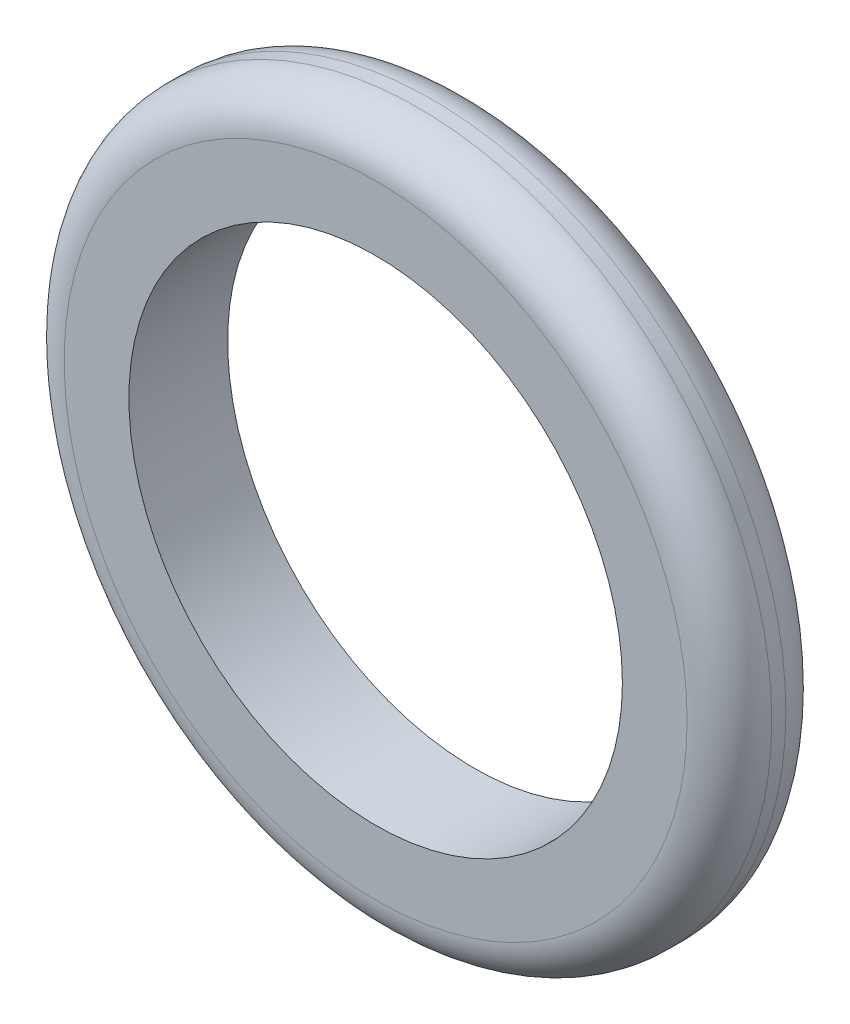
ISO-10303-21;
HEADER;
FILE_DESCRIPTION(('STEP AP214'),'2;1');
FILE_NAME('part.step','',(''),(''),'','','');
FILE_SCHEMA(('AUTOMOTIVE_DESIGN { 1 0 10303 214 1 1 1 1 }'));
ENDSEC;
DATA;
#1=APPLICATION_CONTEXT('core data for automotive mechanical design processes');
#2=APPLICATION_PROTOCOL_DEFINITION('international standard','automotive_design',2000,#1);
#3=PRODUCT_CONTEXT('',#1,'mechanical');
#4=PRODUCT('Part','Part','',(#3));
#5=PRODUCT_RELATED_PRODUCT_CATEGORY('part','',(#4));
#6=PRODUCT_DEFINITION_FORMATION('','',#4);
#7=PRODUCT_DEFINITION_CONTEXT('part definition',#1,'design');
#8=PRODUCT_DEFINITION('design','',#6,#7);
#9=PRODUCT_DEFINITION_SHAPE('','',#8);
#10=(LENGTH_UNIT() NAMED_UNIT(*) SI_UNIT(.MILLI.,.METRE.));
#11=(NAMED_UNIT(*) PLANE_ANGLE_UNIT() SI_UNIT($,.RADIAN.));
#12=(NAMED_UNIT(*) SI_UNIT($,.STERADIAN.) SOLID_ANGLE_UNIT());
#13=UNCERTAINTY_MEASURE_WITH_UNIT(LENGTH_MEASURE(1.E-05),#10,'distance_accuracy_value','');
#14=(GEOMETRIC_REPRESENTATION_CONTEXT(3) GLOBAL_UNCERTAINTY_ASSIGNED_CONTEXT((#13)) GLOBAL_UNIT_ASSIGNED_CONTEXT((#10,
#11,#12)) REPRESENTATION_CONTEXT('',''));
#15=CARTESIAN_POINT('',(0.,0.,0.));
#16=DIRECTION('',(0.,0.,1.));
#17=DIRECTION('',(1.,0.,0.));
#18=AXIS2_PLACEMENT_3D('',#15,#16,#17);
#19=CARTESIAN_POINT('',(0.,-38.2965768946703,35.));
#20=DIRECTION('',(0.,0.,-1.));
#21=DIRECTION('',(-1.,0.,0.));
#22=AXIS2_PLACEMENT_3D('',#19,#20,#21);
#23=CYLINDRICAL_SURFACE('',#22,250.932647595222);
#24=CARTESIAN_POINT('',(0.,-38.2965768946703,-5.));
#25=DIRECTION('',(0.,0.,1.));
#26=DIRECTION('',(1.,0.,0.));
#27=AXIS2_PLACEMENT_3D('',#24,#25,#26);
#28=CIRCLE('',#27,250.932647595222);
#29=CARTESIAN_POINT('',(250.932647595222,-38.2965768946703,-5.));
#30=VERTEX_POINT('',#29);
#31=EDGE_CURVE('E42',#30,#30,#28,.T.);
#32=ORIENTED_EDGE('',*,*,#31,.T.);
#33=EDGE_LOOP('',(#32));
#34=FACE_BOUND('',#33,.T.);
#35=CARTESIAN_POINT('',(0.,-38.2965768946703,5.));
#36=DIRECTION('',(0.,0.,1.));
#37=DIRECTION('',(1.,0.,0.));
#38=AXIS2_PLACEMENT_3D('',#35,#36,#37);
#39=CIRCLE('',#38,250.932647595222);
#40=CARTESIAN_POINT('',(250.932647595222,-38.2965768946703,5.));
#41=VERTEX_POINT('',#40);
#42=EDGE_CURVE('E46',#41,#41,#39,.F.);
#43=ORIENTED_EDGE('',*,*,#42,.T.);
#44=EDGE_LOOP('',(#43));
#45=FACE_BOUND('',#44,.T.);
#46=ADVANCED_FACE('F31',(#34,#45),#23,.T.);
#47=CARTESIAN_POINT('',(0.,-38.2965768946703,35.));
#48=DIRECTION('',(0.,0.,1.));
#49=DIRECTION('',(1.,0.,0.));
#50=AXIS2_PLACEMENT_3D('',#47,#48,#49);
#51=PLANE('',#50);
#52=CARTESIAN_POINT('',(0.,-38.2965768946703,35.));
#53=DIRECTION('',(0.,0.,1.));
#54=DIRECTION('',(1.,0.,0.));
#55=AXIS2_PLACEMENT_3D('',#52,#53,#54);
#56=CIRCLE('',#55,175.);
#57=CARTESIAN_POINT('',(175.,-38.2965768946703,35.));
#58=VERTEX_POINT('',#57);
#59=EDGE_CURVE('E52',#58,#58,#56,.T.);
#60=ORIENTED_EDGE('',*,*,#59,.F.);
#61=EDGE_LOOP('',(#60));
#62=FACE_BOUND('',#61,.T.);
#63=CARTESIAN_POINT('',(0.,-38.2965768946703,35.));
#64=DIRECTION('',(0.,0.,1.));
#65=DIRECTION('',(1.,0.,0.));
#66=AXIS2_PLACEMENT_3D('',#63,#64,#65);
#67=CIRCLE('',#66,220.932647595222);
#68=CARTESIAN_POINT('',(220.932647595222,-38.2965768946703,35.));
#69=VERTEX_POINT('',#68);
#70=EDGE_CURVE('E10',#69,#69,#67,.T.);
#71=ORIENTED_EDGE('',*,*,#70,.T.);
#72=EDGE_LOOP('',(#71));
#73=FACE_BOUND('',#72,.T.);
#74=ADVANCED_FACE('F66',(#62,#73),#51,.T.);
#75=CARTESIAN_POINT('',(0.,-38.2965768946703,-35.));
#76=DIRECTION('',(0.,0.,1.));
#77=DIRECTION('',(1.,0.,0.));
#78=AXIS2_PLACEMENT_3D('',#75,#76,#77);
#79=PLANE('',#78);
#80=CARTESIAN_POINT('',(0.,-38.2965768946703,-35.));
#81=DIRECTION('',(0.,0.,1.));
#82=DIRECTION('',(1.,0.,0.));
#83=AXIS2_PLACEMENT_3D('',#80,#81,#82);
#84=CIRCLE('',#83,175.);
#85=CARTESIAN_POINT('',(175.,-38.2965768946703,-35.));
#86=VERTEX_POINT('',#85);
#87=EDGE_CURVE('E51',#86,#86,#84,.T.);
#88=ORIENTED_EDGE('',*,*,#87,.T.);
#89=EDGE_LOOP('',(#88));
#90=FACE_BOUND('',#89,.T.);
#91=CARTESIAN_POINT('',(0.,-38.2965768946703,-35.));
#92=DIRECTION('',(0.,0.,1.));
#93=DIRECTION('',(1.,0.,0.));
#94=AXIS2_PLACEMENT_3D('',#91,#92,#93);
#95=CIRCLE('',#94,220.932647595222);
#96=CARTESIAN_POINT('',(220.932647595222,-38.2965768946703,-35.));
#97=VERTEX_POINT('',#96);
#98=EDGE_CURVE('E38',#97,#97,#95,.F.);
#99=ORIENTED_EDGE('',*,*,#98,.T.);
#100=EDGE_LOOP('',(#99));
#101=FACE_BOUND('',#100,.T.);
#102=ADVANCED_FACE('F58',(#90,#101),#79,.F.);
#103=CARTESIAN_POINT('',(0.,-38.2965768946703,-5.));
#104=DIRECTION('',(0.,0.,1.));
#105=DIRECTION('',(1.,0.,0.));
#106=AXIS2_PLACEMENT_3D('',#103,#104,#105);
#107=TOROIDAL_SURFACE('',#106,220.932647595222,30.);
#108=ORIENTED_EDGE('',*,*,#98,.F.);
#109=EDGE_LOOP('',(#108));
#110=FACE_BOUND('',#109,.T.);
#111=ORIENTED_EDGE('',*,*,#31,.F.);
#112=EDGE_LOOP('',(#111));
#113=FACE_BOUND('',#112,.T.);
#114=ADVANCED_FACE('F73',(#110,#113),#107,.T.);
#115=CARTESIAN_POINT('',(0.,-38.2965768946703,5.));
#116=DIRECTION('',(0.,0.,1.));
#117=DIRECTION('',(1.,0.,0.));
#118=AXIS2_PLACEMENT_3D('',#115,#116,#117);
#119=TOROIDAL_SURFACE('',#118,220.932647595222,30.);
#120=ORIENTED_EDGE('',*,*,#42,.F.);
#121=EDGE_LOOP('',(#120));
#122=FACE_BOUND('',#121,.T.);
#123=ORIENTED_EDGE('',*,*,#70,.F.);
#124=EDGE_LOOP('',(#123));
#125=FACE_BOUND('',#124,.T.);
#126=ADVANCED_FACE('F33',(#122,#125),#119,.T.);
#127=CARTESIAN_POINT('',(0.,-38.2965768946703,-35.));
#128=DIRECTION('',(0.,0.,1.));
#129=DIRECTION('',(1.,0.,0.));
#130=AXIS2_PLACEMENT_3D('',#127,#128,#129);
#131=CYLINDRICAL_SURFACE('',#130,175.);
#132=ORIENTED_EDGE('',*,*,#87,.F.);
#133=EDGE_LOOP('',(#132));
#134=FACE_BOUND('',#133,.T.);
#135=ORIENTED_EDGE('',*,*,#59,.T.);
#136=EDGE_LOOP('',(#135));
#137=FACE_BOUND('',#136,.T.);
#138=ADVANCED_FACE('F60',(#134,#137),#131,.F.);
#139=CLOSED_SHELL('',(#46,#74,#102,#114,#126,#138));
#140=MANIFOLD_SOLID_BREP('B2',#139);
#141=ADVANCED_BREP_SHAPE_REPRESENTATION('',(#18,#140),#14);
#142=SHAPE_DEFINITION_REPRESENTATION(#9,#141);
ENDSEC;
END-ISO-10303-21;
